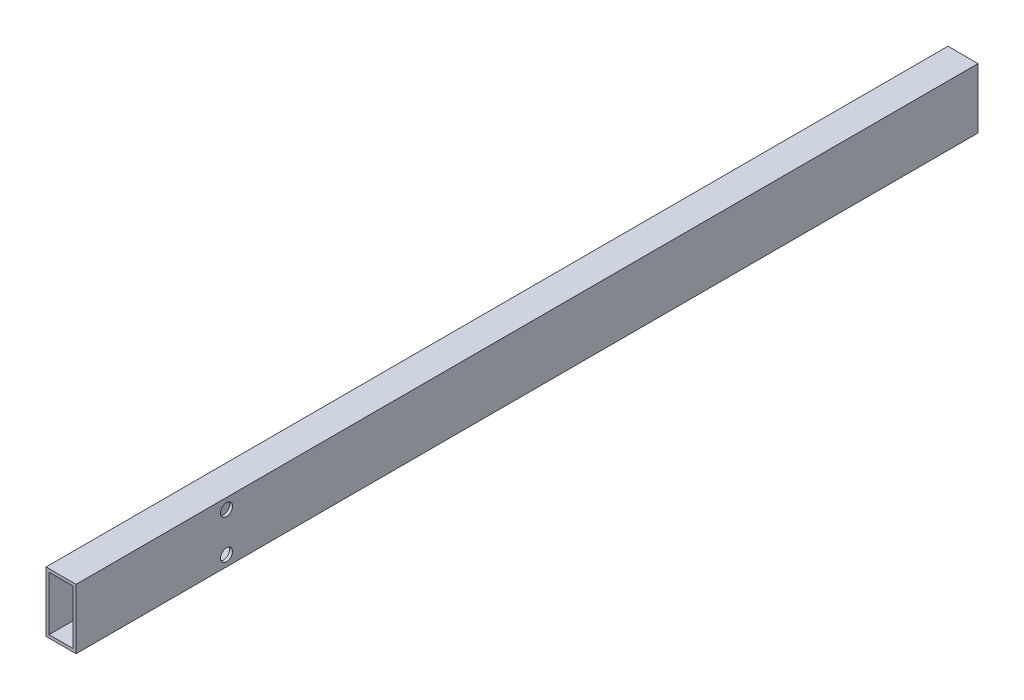
ISO-10303-21;
HEADER;
FILE_DESCRIPTION(('STEP AP214'),'2;1');
FILE_NAME('part.step','',(''),(''),'','','');
FILE_SCHEMA(('AUTOMOTIVE_DESIGN { 1 0 10303 214 1 1 1 1 }'));
ENDSEC;
DATA;
#1=APPLICATION_CONTEXT('core data for automotive mechanical design processes');
#2=APPLICATION_PROTOCOL_DEFINITION('international standard','automotive_design',2000,#1);
#3=PRODUCT_CONTEXT('',#1,'mechanical');
#4=PRODUCT('Part','Part','',(#3));
#5=PRODUCT_RELATED_PRODUCT_CATEGORY('part','',(#4));
#6=PRODUCT_DEFINITION_FORMATION('','',#4);
#7=PRODUCT_DEFINITION_CONTEXT('part definition',#1,'design');
#8=PRODUCT_DEFINITION('design','',#6,#7);
#9=PRODUCT_DEFINITION_SHAPE('','',#8);
#10=(LENGTH_UNIT() NAMED_UNIT(*) SI_UNIT(.MILLI.,.METRE.));
#11=(NAMED_UNIT(*) PLANE_ANGLE_UNIT() SI_UNIT($,.RADIAN.));
#12=(NAMED_UNIT(*) SI_UNIT($,.STERADIAN.) SOLID_ANGLE_UNIT());
#13=UNCERTAINTY_MEASURE_WITH_UNIT(LENGTH_MEASURE(1.E-05),#10,'distance_accuracy_value','');
#14=(GEOMETRIC_REPRESENTATION_CONTEXT(3) GLOBAL_UNCERTAINTY_ASSIGNED_CONTEXT((#13)) GLOBAL_UNIT_ASSIGNED_CONTEXT((#10,
#11,#12)) REPRESENTATION_CONTEXT('',''));
#15=CARTESIAN_POINT('',(0.,0.,0.));
#16=DIRECTION('',(0.,0.,1.));
#17=DIRECTION('',(1.,0.,0.));
#18=AXIS2_PLACEMENT_3D('',#15,#16,#17);
#19=CARTESIAN_POINT('',(5.,10.,150.));
#20=DIRECTION('',(-1.,0.,0.));
#21=DIRECTION('',(0.,0.,1.));
#22=AXIS2_PLACEMENT_3D('',#19,#20,#21);
#23=PLANE('',#22);
#24=CARTESIAN_POINT('',(5.,6.5,99.9551986898399));
#25=DIRECTION('',(1.,0.,0.));
#26=DIRECTION('',(0.,0.,-1.));
#27=AXIS2_PLACEMENT_3D('',#24,#25,#26);
#28=CIRCLE('',#27,2.);
#29=CARTESIAN_POINT('',(5.,6.5,97.9551986898399));
#30=VERTEX_POINT('',#29);
#31=EDGE_CURVE('E170',#30,#30,#28,.T.);
#32=ORIENTED_EDGE('',*,*,#31,.F.);
#33=EDGE_LOOP('',(#32));
#34=FACE_BOUND('',#33,.T.);
#35=CARTESIAN_POINT('',(5.,-6.5,99.9551986898399));
#36=DIRECTION('',(1.,0.,0.));
#37=DIRECTION('',(0.,0.,-1.));
#38=AXIS2_PLACEMENT_3D('',#35,#36,#37);
#39=CIRCLE('',#38,2.);
#40=CARTESIAN_POINT('',(5.,-6.5,97.9551986898399));
#41=VERTEX_POINT('',#40);
#42=EDGE_CURVE('E177',#41,#41,#39,.T.);
#43=ORIENTED_EDGE('',*,*,#42,.F.);
#44=EDGE_LOOP('',(#43));
#45=FACE_BOUND('',#44,.T.);
#46=DIRECTION('',(0.,1.,0.));
#47=VECTOR('',#46,1.);
#48=CARTESIAN_POINT('',(5.,10.,-150.));
#49=LINE('',#48,#47);
#50=CARTESIAN_POINT('',(5.,-10.,-150.));
#51=VERTEX_POINT('',#50);
#52=CARTESIAN_POINT('',(5.,10.,-150.));
#53=VERTEX_POINT('',#52);
#54=EDGE_CURVE('E155',#51,#53,#49,.T.);
#55=ORIENTED_EDGE('',*,*,#54,.T.);
#56=DIRECTION('',(0.,0.,-1.));
#57=VECTOR('',#56,1.);
#58=CARTESIAN_POINT('',(5.,10.,150.));
#59=LINE('',#58,#57);
#60=CARTESIAN_POINT('',(5.,10.,150.));
#61=VERTEX_POINT('',#60);
#62=EDGE_CURVE('E11',#61,#53,#59,.T.);
#63=ORIENTED_EDGE('',*,*,#62,.F.);
#64=DIRECTION('',(0.,1.,0.));
#65=VECTOR('',#64,1.);
#66=CARTESIAN_POINT('',(5.,10.,150.));
#67=LINE('',#66,#65);
#68=CARTESIAN_POINT('',(5.,-10.,150.));
#69=VERTEX_POINT('',#68);
#70=EDGE_CURVE('E148',#69,#61,#67,.T.);
#71=ORIENTED_EDGE('',*,*,#70,.F.);
#72=DIRECTION('',(0.,0.,-1.));
#73=VECTOR('',#72,1.);
#74=CARTESIAN_POINT('',(5.,-10.,150.));
#75=LINE('',#74,#73);
#76=EDGE_CURVE('E154',#69,#51,#75,.T.);
#77=ORIENTED_EDGE('',*,*,#76,.T.);
#78=EDGE_LOOP('',(#55,#63,#71,#77));
#79=FACE_BOUND('',#78,.T.);
#80=ADVANCED_FACE('F39',(#34,#45,#79),#23,.F.);
#81=CARTESIAN_POINT('',(-5.,10.,150.));
#82=DIRECTION('',(0.,-1.,0.));
#83=DIRECTION('',(0.,0.,-1.));
#84=AXIS2_PLACEMENT_3D('',#81,#82,#83);
#85=PLANE('',#84);
#86=DIRECTION('',(-1.,0.,0.));
#87=VECTOR('',#86,1.);
#88=CARTESIAN_POINT('',(-5.,10.,-150.));
#89=LINE('',#88,#87);
#90=CARTESIAN_POINT('',(-5.,10.,-150.));
#91=VERTEX_POINT('',#90);
#92=EDGE_CURVE('E158',#53,#91,#89,.T.);
#93=ORIENTED_EDGE('',*,*,#92,.T.);
#94=DIRECTION('',(0.,0.,-1.));
#95=VECTOR('',#94,1.);
#96=CARTESIAN_POINT('',(-5.,10.,150.));
#97=LINE('',#96,#95);
#98=CARTESIAN_POINT('',(-5.,10.,150.));
#99=VERTEX_POINT('',#98);
#100=EDGE_CURVE('E47',#99,#91,#97,.T.);
#101=ORIENTED_EDGE('',*,*,#100,.F.);
#102=DIRECTION('',(-1.,0.,0.));
#103=VECTOR('',#102,1.);
#104=CARTESIAN_POINT('',(-5.,10.,150.));
#105=LINE('',#104,#103);
#106=EDGE_CURVE('E92',#61,#99,#105,.T.);
#107=ORIENTED_EDGE('',*,*,#106,.F.);
#108=ORIENTED_EDGE('',*,*,#62,.T.);
#109=EDGE_LOOP('',(#93,#101,#107,#108));
#110=FACE_BOUND('',#109,.T.);
#111=ADVANCED_FACE('F211',(#110),#85,.F.);
#112=CARTESIAN_POINT('',(-5.,10.,150.));
#113=DIRECTION('',(1.,0.,0.));
#114=DIRECTION('',(0.,1.,0.));
#115=AXIS2_PLACEMENT_3D('',#112,#113,#114);
#116=PLANE('',#115);
#117=CARTESIAN_POINT('',(-5.,6.5,99.9551986898399));
#118=DIRECTION('',(1.,0.,0.));
#119=DIRECTION('',(0.,1.,0.));
#120=AXIS2_PLACEMENT_3D('',#117,#118,#119);
#121=CIRCLE('',#120,2.);
#122=CARTESIAN_POINT('',(-5.,8.49999999999999,99.9551986898399));
#123=VERTEX_POINT('',#122);
#124=EDGE_CURVE('E189',#123,#123,#121,.T.);
#125=ORIENTED_EDGE('',*,*,#124,.T.);
#126=EDGE_LOOP('',(#125));
#127=FACE_BOUND('',#126,.T.);
#128=CARTESIAN_POINT('',(-5.,-6.5,99.9551986898399));
#129=DIRECTION('',(1.,0.,0.));
#130=DIRECTION('',(0.,1.,0.));
#131=AXIS2_PLACEMENT_3D('',#128,#129,#130);
#132=CIRCLE('',#131,2.);
#133=CARTESIAN_POINT('',(-5.,-4.5,99.9551986898399));
#134=VERTEX_POINT('',#133);
#135=EDGE_CURVE('E174',#134,#134,#132,.T.);
#136=ORIENTED_EDGE('',*,*,#135,.T.);
#137=EDGE_LOOP('',(#136));
#138=FACE_BOUND('',#137,.T.);
#139=DIRECTION('',(0.,-1.,0.));
#140=VECTOR('',#139,1.);
#141=CARTESIAN_POINT('',(-5.,10.,-150.));
#142=LINE('',#141,#140);
#143=CARTESIAN_POINT('',(-5.,-10.,-150.));
#144=VERTEX_POINT('',#143);
#145=EDGE_CURVE('E160',#91,#144,#142,.T.);
#146=ORIENTED_EDGE('',*,*,#145,.T.);
#147=DIRECTION('',(0.,0.,-1.));
#148=VECTOR('',#147,1.);
#149=CARTESIAN_POINT('',(-5.,-10.,150.));
#150=LINE('',#149,#148);
#151=CARTESIAN_POINT('',(-5.,-10.,150.));
#152=VERTEX_POINT('',#151);
#153=EDGE_CURVE('E164',#152,#144,#150,.T.);
#154=ORIENTED_EDGE('',*,*,#153,.F.);
#155=DIRECTION('',(0.,-1.,0.));
#156=VECTOR('',#155,1.);
#157=CARTESIAN_POINT('',(-5.,10.,150.));
#158=LINE('',#157,#156);
#159=EDGE_CURVE('E151',#99,#152,#158,.T.);
#160=ORIENTED_EDGE('',*,*,#159,.F.);
#161=ORIENTED_EDGE('',*,*,#100,.T.);
#162=EDGE_LOOP('',(#146,#154,#160,#161));
#163=FACE_BOUND('',#162,.T.);
#164=ADVANCED_FACE('F216',(#127,#138,#163),#116,.F.);
#165=CARTESIAN_POINT('',(-5.,-10.,150.));
#166=DIRECTION('',(0.,1.,0.));
#167=DIRECTION('',(0.,0.,1.));
#168=AXIS2_PLACEMENT_3D('',#165,#166,#167);
#169=PLANE('',#168);
#170=DIRECTION('',(1.,0.,0.));
#171=VECTOR('',#170,1.);
#172=CARTESIAN_POINT('',(-5.,-10.,-150.));
#173=LINE('',#172,#171);
#174=EDGE_CURVE('E85',#144,#51,#173,.T.);
#175=ORIENTED_EDGE('',*,*,#174,.T.);
#176=ORIENTED_EDGE('',*,*,#76,.F.);
#177=DIRECTION('',(1.,0.,0.));
#178=VECTOR('',#177,1.);
#179=CARTESIAN_POINT('',(-5.,-10.,150.));
#180=LINE('',#179,#178);
#181=EDGE_CURVE('E64',#152,#69,#180,.T.);
#182=ORIENTED_EDGE('',*,*,#181,.F.);
#183=ORIENTED_EDGE('',*,*,#153,.T.);
#184=EDGE_LOOP('',(#175,#176,#182,#183));
#185=FACE_BOUND('',#184,.T.);
#186=ADVANCED_FACE('F205',(#185),#169,.F.);
#187=CARTESIAN_POINT('',(0.,0.,150.));
#188=DIRECTION('',(0.,0.,1.));
#189=DIRECTION('',(1.,0.,0.));
#190=AXIS2_PLACEMENT_3D('',#187,#188,#189);
#191=PLANE('',#190);
#192=DIRECTION('',(0.,1.,0.));
#193=VECTOR('',#192,1.);
#194=CARTESIAN_POINT('',(4.,10.,150.));
#195=LINE('',#194,#193);
#196=CARTESIAN_POINT('',(4.,-9.00000000000001,150.));
#197=VERTEX_POINT('',#196);
#198=CARTESIAN_POINT('',(4.,9.,150.));
#199=VERTEX_POINT('',#198);
#200=EDGE_CURVE('E137',#197,#199,#195,.T.);
#201=ORIENTED_EDGE('',*,*,#200,.F.);
#202=DIRECTION('',(1.,0.,0.));
#203=VECTOR('',#202,1.);
#204=CARTESIAN_POINT('',(-5.,-9.00000000000001,150.));
#205=LINE('',#204,#203);
#206=CARTESIAN_POINT('',(-4.,-9.00000000000001,150.));
#207=VERTEX_POINT('',#206);
#208=EDGE_CURVE('E146',#207,#197,#205,.T.);
#209=ORIENTED_EDGE('',*,*,#208,.F.);
#210=DIRECTION('',(0.,-1.,0.));
#211=VECTOR('',#210,1.);
#212=CARTESIAN_POINT('',(-4.,10.,150.));
#213=LINE('',#212,#211);
#214=CARTESIAN_POINT('',(-4.,9.,150.));
#215=VERTEX_POINT('',#214);
#216=EDGE_CURVE('E144',#215,#207,#213,.T.);
#217=ORIENTED_EDGE('',*,*,#216,.F.);
#218=DIRECTION('',(-1.,0.,0.));
#219=VECTOR('',#218,1.);
#220=CARTESIAN_POINT('',(-5.,9.,150.));
#221=LINE('',#220,#219);
#222=EDGE_CURVE('E129',#199,#215,#221,.T.);
#223=ORIENTED_EDGE('',*,*,#222,.F.);
#224=EDGE_LOOP('',(#201,#209,#217,#223));
#225=FACE_BOUND('',#224,.T.);
#226=ORIENTED_EDGE('',*,*,#70,.T.);
#227=ORIENTED_EDGE('',*,*,#106,.T.);
#228=ORIENTED_EDGE('',*,*,#159,.T.);
#229=ORIENTED_EDGE('',*,*,#181,.T.);
#230=EDGE_LOOP('',(#226,#227,#228,#229));
#231=FACE_BOUND('',#230,.T.);
#232=ADVANCED_FACE('F202',(#225,#231),#191,.T.);
#233=CARTESIAN_POINT('',(0.,0.,-150.));
#234=DIRECTION('',(0.,0.,1.));
#235=DIRECTION('',(1.,0.,0.));
#236=AXIS2_PLACEMENT_3D('',#233,#234,#235);
#237=PLANE('',#236);
#238=ORIENTED_EDGE('',*,*,#54,.F.);
#239=ORIENTED_EDGE('',*,*,#174,.F.);
#240=ORIENTED_EDGE('',*,*,#145,.F.);
#241=ORIENTED_EDGE('',*,*,#92,.F.);
#242=EDGE_LOOP('',(#238,#239,#240,#241));
#243=FACE_BOUND('',#242,.T.);
#244=ADVANCED_FACE('F204',(#243),#237,.F.);
#245=CARTESIAN_POINT('',(4.,10.,150.));
#246=DIRECTION('',(-1.,0.,0.));
#247=DIRECTION('',(0.,0.,1.));
#248=AXIS2_PLACEMENT_3D('',#245,#246,#247);
#249=PLANE('',#248);
#250=CARTESIAN_POINT('',(4.,6.5,99.9551986898399));
#251=DIRECTION('',(-1.,0.,0.));
#252=DIRECTION('',(0.,0.,1.));
#253=AXIS2_PLACEMENT_3D('',#250,#251,#252);
#254=CIRCLE('',#253,2.);
#255=CARTESIAN_POINT('',(4.,6.5,101.95519868984));
#256=VERTEX_POINT('',#255);
#257=EDGE_CURVE('E186',#256,#256,#254,.T.);
#258=ORIENTED_EDGE('',*,*,#257,.F.);
#259=EDGE_LOOP('',(#258));
#260=FACE_BOUND('',#259,.T.);
#261=CARTESIAN_POINT('',(4.,-6.5,99.9551986898399));
#262=DIRECTION('',(-1.,0.,0.));
#263=DIRECTION('',(0.,0.,1.));
#264=AXIS2_PLACEMENT_3D('',#261,#262,#263);
#265=CIRCLE('',#264,2.);
#266=CARTESIAN_POINT('',(4.,-6.5,101.95519868984));
#267=VERTEX_POINT('',#266);
#268=EDGE_CURVE('E169',#267,#267,#265,.T.);
#269=ORIENTED_EDGE('',*,*,#268,.F.);
#270=EDGE_LOOP('',(#269));
#271=FACE_BOUND('',#270,.T.);
#272=DIRECTION('',(0.,1.,0.));
#273=VECTOR('',#272,1.);
#274=CARTESIAN_POINT('',(4.,10.,-149.));
#275=LINE('',#274,#273);
#276=CARTESIAN_POINT('',(4.,-9.00000000000001,-149.));
#277=VERTEX_POINT('',#276);
#278=CARTESIAN_POINT('',(4.,9.,-149.));
#279=VERTEX_POINT('',#278);
#280=EDGE_CURVE('E120',#277,#279,#275,.T.);
#281=ORIENTED_EDGE('',*,*,#280,.F.);
#282=DIRECTION('',(0.,0.,-1.));
#283=VECTOR('',#282,1.);
#284=CARTESIAN_POINT('',(4.,-9.00000000000001,150.));
#285=LINE('',#284,#283);
#286=EDGE_CURVE('E140',#197,#277,#285,.T.);
#287=ORIENTED_EDGE('',*,*,#286,.F.);
#288=ORIENTED_EDGE('',*,*,#200,.T.);
#289=DIRECTION('',(0.,0.,-1.));
#290=VECTOR('',#289,1.);
#291=CARTESIAN_POINT('',(4.,9.,150.));
#292=LINE('',#291,#290);
#293=EDGE_CURVE('E132',#199,#279,#292,.T.);
#294=ORIENTED_EDGE('',*,*,#293,.T.);
#295=EDGE_LOOP('',(#281,#287,#288,#294));
#296=FACE_BOUND('',#295,.T.);
#297=ADVANCED_FACE('F200',(#260,#271,#296),#249,.T.);
#298=CARTESIAN_POINT('',(-5.,9.,150.));
#299=DIRECTION('',(0.,-1.,0.));
#300=DIRECTION('',(0.,0.,-1.));
#301=AXIS2_PLACEMENT_3D('',#298,#299,#300);
#302=PLANE('',#301);
#303=DIRECTION('',(-1.,0.,0.));
#304=VECTOR('',#303,1.);
#305=CARTESIAN_POINT('',(-5.,9.,-149.));
#306=LINE('',#305,#304);
#307=CARTESIAN_POINT('',(-4.,9.,-149.));
#308=VERTEX_POINT('',#307);
#309=EDGE_CURVE('E114',#279,#308,#306,.T.);
#310=ORIENTED_EDGE('',*,*,#309,.F.);
#311=ORIENTED_EDGE('',*,*,#293,.F.);
#312=ORIENTED_EDGE('',*,*,#222,.T.);
#313=DIRECTION('',(0.,0.,-1.));
#314=VECTOR('',#313,1.);
#315=CARTESIAN_POINT('',(-4.,9.,150.));
#316=LINE('',#315,#314);
#317=EDGE_CURVE('E126',#215,#308,#316,.T.);
#318=ORIENTED_EDGE('',*,*,#317,.T.);
#319=EDGE_LOOP('',(#310,#311,#312,#318));
#320=FACE_BOUND('',#319,.T.);
#321=ADVANCED_FACE('F127',(#320),#302,.T.);
#322=CARTESIAN_POINT('',(-4.,10.,150.));
#323=DIRECTION('',(1.,0.,0.));
#324=DIRECTION('',(0.,1.,0.));
#325=AXIS2_PLACEMENT_3D('',#322,#323,#324);
#326=PLANE('',#325);
#327=CARTESIAN_POINT('',(-4.,6.5,99.9551986898399));
#328=DIRECTION('',(1.,0.,0.));
#329=DIRECTION('',(0.,1.,0.));
#330=AXIS2_PLACEMENT_3D('',#327,#328,#329);
#331=CIRCLE('',#330,2.);
#332=CARTESIAN_POINT('',(-4.,8.49999999999999,99.9551986898399));
#333=VERTEX_POINT('',#332);
#334=EDGE_CURVE('E42',#333,#333,#331,.T.);
#335=ORIENTED_EDGE('',*,*,#334,.F.);
#336=EDGE_LOOP('',(#335));
#337=FACE_BOUND('',#336,.T.);
#338=CARTESIAN_POINT('',(-4.,-6.5,99.9551986898399));
#339=DIRECTION('',(1.,0.,0.));
#340=DIRECTION('',(0.,1.,0.));
#341=AXIS2_PLACEMENT_3D('',#338,#339,#340);
#342=CIRCLE('',#341,2.);
#343=CARTESIAN_POINT('',(-4.,-4.5,99.9551986898399));
#344=VERTEX_POINT('',#343);
#345=EDGE_CURVE('E167',#344,#344,#342,.T.);
#346=ORIENTED_EDGE('',*,*,#345,.F.);
#347=EDGE_LOOP('',(#346));
#348=FACE_BOUND('',#347,.T.);
#349=DIRECTION('',(0.,-1.,0.));
#350=VECTOR('',#349,1.);
#351=CARTESIAN_POINT('',(-4.,10.,-149.));
#352=LINE('',#351,#350);
#353=CARTESIAN_POINT('',(-4.,-9.00000000000001,-149.));
#354=VERTEX_POINT('',#353);
#355=EDGE_CURVE('E118',#308,#354,#352,.T.);
#356=ORIENTED_EDGE('',*,*,#355,.F.);
#357=ORIENTED_EDGE('',*,*,#317,.F.);
#358=ORIENTED_EDGE('',*,*,#216,.T.);
#359=DIRECTION('',(0.,0.,-1.));
#360=VECTOR('',#359,1.);
#361=CARTESIAN_POINT('',(-4.,-9.00000000000001,150.));
#362=LINE('',#361,#360);
#363=EDGE_CURVE('E55',#207,#354,#362,.T.);
#364=ORIENTED_EDGE('',*,*,#363,.T.);
#365=EDGE_LOOP('',(#356,#357,#358,#364));
#366=FACE_BOUND('',#365,.T.);
#367=ADVANCED_FACE('F134',(#337,#348,#366),#326,.T.);
#368=CARTESIAN_POINT('',(-5.,-9.00000000000001,150.));
#369=DIRECTION('',(0.,1.,0.));
#370=DIRECTION('',(0.,0.,1.));
#371=AXIS2_PLACEMENT_3D('',#368,#369,#370);
#372=PLANE('',#371);
#373=DIRECTION('',(1.,0.,0.));
#374=VECTOR('',#373,1.);
#375=CARTESIAN_POINT('',(-5.,-9.00000000000001,-149.));
#376=LINE('',#375,#374);
#377=EDGE_CURVE('E135',#354,#277,#376,.T.);
#378=ORIENTED_EDGE('',*,*,#377,.F.);
#379=ORIENTED_EDGE('',*,*,#363,.F.);
#380=ORIENTED_EDGE('',*,*,#208,.T.);
#381=ORIENTED_EDGE('',*,*,#286,.T.);
#382=EDGE_LOOP('',(#378,#379,#380,#381));
#383=FACE_BOUND('',#382,.T.);
#384=ADVANCED_FACE('F196',(#383),#372,.T.);
#385=CARTESIAN_POINT('',(0.,0.,-149.));
#386=DIRECTION('',(0.,0.,1.));
#387=DIRECTION('',(1.,0.,0.));
#388=AXIS2_PLACEMENT_3D('',#385,#386,#387);
#389=PLANE('',#388);
#390=ORIENTED_EDGE('',*,*,#280,.T.);
#391=ORIENTED_EDGE('',*,*,#309,.T.);
#392=ORIENTED_EDGE('',*,*,#355,.T.);
#393=ORIENTED_EDGE('',*,*,#377,.T.);
#394=EDGE_LOOP('',(#390,#391,#392,#393));
#395=FACE_BOUND('',#394,.T.);
#396=ADVANCED_FACE('F116',(#395),#389,.T.);
#397=CARTESIAN_POINT('',(-13.,-6.5,99.9551986898399));
#398=DIRECTION('',(1.,0.,0.));
#399=DIRECTION('',(0.,0.,-1.));
#400=AXIS2_PLACEMENT_3D('',#397,#398,#399);
#401=CYLINDRICAL_SURFACE('',#400,2.);
#402=ORIENTED_EDGE('',*,*,#345,.T.);
#403=EDGE_LOOP('',(#402));
#404=FACE_BOUND('',#403,.T.);
#405=ORIENTED_EDGE('',*,*,#135,.F.);
#406=EDGE_LOOP('',(#405));
#407=FACE_BOUND('',#406,.T.);
#408=ADVANCED_FACE('F240',(#404,#407),#401,.F.);
#409=CARTESIAN_POINT('',(-13.,6.5,99.9551986898399));
#410=DIRECTION('',(1.,0.,0.));
#411=DIRECTION('',(0.,0.,-1.));
#412=AXIS2_PLACEMENT_3D('',#409,#410,#411);
#413=CYLINDRICAL_SURFACE('',#412,2.);
#414=ORIENTED_EDGE('',*,*,#334,.T.);
#415=EDGE_LOOP('',(#414));
#416=FACE_BOUND('',#415,.T.);
#417=ORIENTED_EDGE('',*,*,#124,.F.);
#418=EDGE_LOOP('',(#417));
#419=FACE_BOUND('',#418,.T.);
#420=ADVANCED_FACE('F237',(#416,#419),#413,.F.);
#421=ORIENTED_EDGE('',*,*,#268,.T.);
#422=EDGE_LOOP('',(#421));
#423=FACE_BOUND('',#422,.T.);
#424=ORIENTED_EDGE('',*,*,#42,.T.);
#425=EDGE_LOOP('',(#424));
#426=FACE_BOUND('',#425,.T.);
#427=ADVANCED_FACE('F234',(#423,#426),#401,.F.);
#428=ORIENTED_EDGE('',*,*,#257,.T.);
#429=EDGE_LOOP('',(#428));
#430=FACE_BOUND('',#429,.T.);
#431=ORIENTED_EDGE('',*,*,#31,.T.);
#432=EDGE_LOOP('',(#431));
#433=FACE_BOUND('',#432,.T.);
#434=ADVANCED_FACE('F236',(#430,#433),#413,.F.);
#435=CLOSED_SHELL('',(#80,#111,#164,#186,#232,#244,#297,#321,#367,#384,#396,#408,#420,#427,#434));
#436=MANIFOLD_SOLID_BREP('B2',#435);
#437=ADVANCED_BREP_SHAPE_REPRESENTATION('',(#18,#436),#14);
#438=SHAPE_DEFINITION_REPRESENTATION(#9,#437);
ENDSEC;
END-ISO-10303-21;
